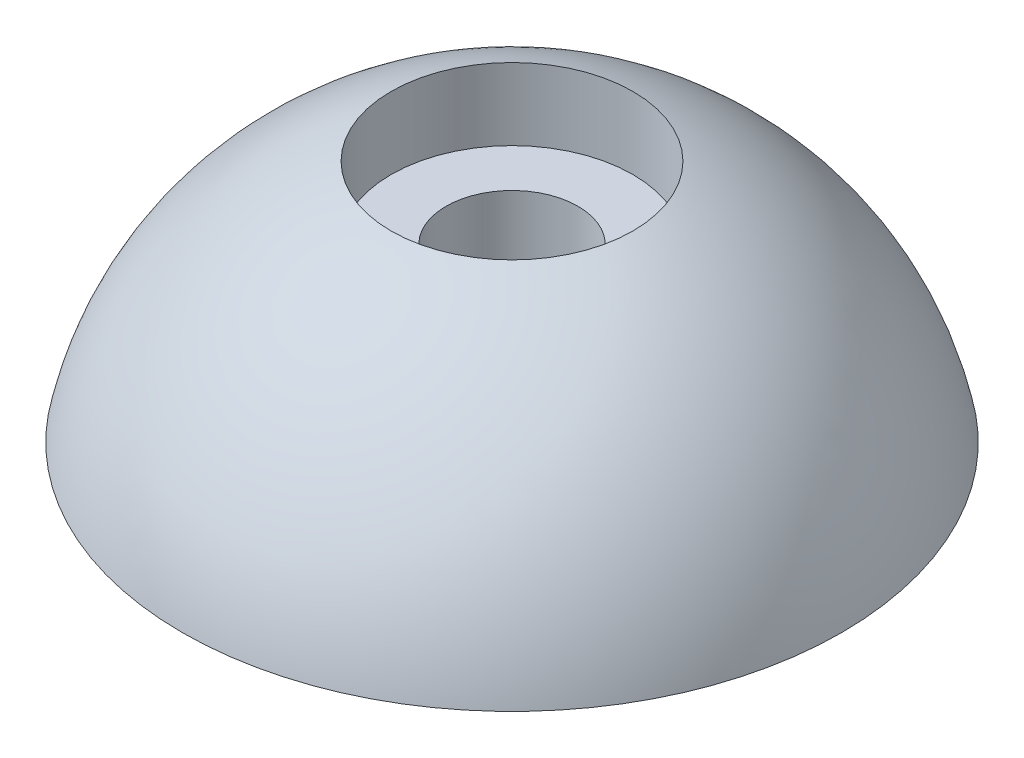
ISO-10303-21;
HEADER;
FILE_DESCRIPTION(('STEP AP214'),'2;1');
FILE_NAME('part.step','',(''),(''),'','','');
FILE_SCHEMA(('AUTOMOTIVE_DESIGN { 1 0 10303 214 1 1 1 1 }'));
ENDSEC;
DATA;
#1=APPLICATION_CONTEXT('core data for automotive mechanical design processes');
#2=APPLICATION_PROTOCOL_DEFINITION('international standard','automotive_design',2000,#1);
#3=PRODUCT_CONTEXT('',#1,'mechanical');
#4=PRODUCT('Part','Part','',(#3));
#5=PRODUCT_RELATED_PRODUCT_CATEGORY('part','',(#4));
#6=PRODUCT_DEFINITION_FORMATION('','',#4);
#7=PRODUCT_DEFINITION_CONTEXT('part definition',#1,'design');
#8=PRODUCT_DEFINITION('design','',#6,#7);
#9=PRODUCT_DEFINITION_SHAPE('','',#8);
#10=(LENGTH_UNIT() NAMED_UNIT(*) SI_UNIT(.MILLI.,.METRE.));
#11=(NAMED_UNIT(*) PLANE_ANGLE_UNIT() SI_UNIT($,.RADIAN.));
#12=(NAMED_UNIT(*) SI_UNIT($,.STERADIAN.) SOLID_ANGLE_UNIT());
#13=UNCERTAINTY_MEASURE_WITH_UNIT(LENGTH_MEASURE(1.E-05),#10,'distance_accuracy_value','');
#14=(GEOMETRIC_REPRESENTATION_CONTEXT(3) GLOBAL_UNCERTAINTY_ASSIGNED_CONTEXT((#13)) GLOBAL_UNIT_ASSIGNED_CONTEXT((#10,
#11,#12)) REPRESENTATION_CONTEXT('',''));
#15=CARTESIAN_POINT('',(0.,0.,0.));
#16=DIRECTION('',(0.,0.,1.));
#17=DIRECTION('',(1.,0.,0.));
#18=AXIS2_PLACEMENT_3D('',#15,#16,#17);
#19=CARTESIAN_POINT('',(0.,-1.49847535147242,0.));
#20=DIRECTION('',(0.,-1.,0.));
#21=DIRECTION('',(0.,0.,-1.));
#22=AXIS2_PLACEMENT_3D('',#19,#20,#21);
#23=DEGENERATE_TOROIDAL_SURFACE('',#22,0.151219718822067,7.5,.T.);
#24=CARTESIAN_POINT('',(0.,0.,0.));
#25=DIRECTION('',(0.,-1.,0.));
#26=DIRECTION('',(0.,0.,-1.));
#27=AXIS2_PLACEMENT_3D('',#24,#25,#26);
#28=CIRCLE('',#27,7.5);
#29=CARTESIAN_POINT('',(0.,0.,-7.5));
#30=VERTEX_POINT('',#29);
#31=EDGE_CURVE('E10',#30,#30,#28,.T.);
#32=ORIENTED_EDGE('',*,*,#31,.F.);
#33=EDGE_LOOP('',(#32));
#34=FACE_BOUND('',#33,.T.);
#35=CARTESIAN_POINT('',(0.,5.53688825321503,0.));
#36=DIRECTION('',(0.,-1.,0.));
#37=DIRECTION('',(0.,0.,-1.));
#38=AXIS2_PLACEMENT_3D('',#35,#36,#37);
#39=CIRCLE('',#38,2.75);
#40=CARTESIAN_POINT('',(0.,5.53688825321503,-2.75));
#41=VERTEX_POINT('',#40);
#42=EDGE_CURVE('E34',#41,#41,#39,.T.);
#43=ORIENTED_EDGE('',*,*,#42,.T.);
#44=EDGE_LOOP('',(#43));
#45=FACE_BOUND('',#44,.T.);
#46=ADVANCED_FACE('F30',(#34,#45),#23,.T.);
#47=CARTESIAN_POINT('',(0.,0.,0.));
#48=DIRECTION('',(0.,-1.,0.));
#49=DIRECTION('',(0.,0.,-1.));
#50=AXIS2_PLACEMENT_3D('',#47,#48,#49);
#51=PLANE('',#50);
#52=CARTESIAN_POINT('',(0.,0.,0.));
#53=DIRECTION('',(0.,-1.,0.));
#54=DIRECTION('',(0.,0.,-1.));
#55=AXIS2_PLACEMENT_3D('',#52,#53,#54);
#56=CIRCLE('',#55,1.5);
#57=CARTESIAN_POINT('',(0.,0.,-1.5));
#58=VERTEX_POINT('',#57);
#59=EDGE_CURVE('E38',#58,#58,#56,.T.);
#60=ORIENTED_EDGE('',*,*,#59,.F.);
#61=EDGE_LOOP('',(#60));
#62=FACE_BOUND('',#61,.T.);
#63=ORIENTED_EDGE('',*,*,#31,.T.);
#64=EDGE_LOOP('',(#63));
#65=FACE_BOUND('',#64,.T.);
#66=ADVANCED_FACE('F32',(#62,#65),#51,.T.);
#67=CARTESIAN_POINT('',(0.,6.00152464852758,0.));
#68=DIRECTION('',(0.,-1.,0.));
#69=DIRECTION('',(0.,0.,-1.));
#70=AXIS2_PLACEMENT_3D('',#67,#68,#69);
#71=CYLINDRICAL_SURFACE('',#70,1.5);
#72=CARTESIAN_POINT('',(0.,3.9,0.));
#73=DIRECTION('',(0.,-1.,0.));
#74=DIRECTION('',(0.,0.,-1.));
#75=AXIS2_PLACEMENT_3D('',#72,#73,#74);
#76=CIRCLE('',#75,1.5);
#77=CARTESIAN_POINT('',(0.,3.9,-1.5));
#78=VERTEX_POINT('',#77);
#79=EDGE_CURVE('E45',#78,#78,#76,.F.);
#80=ORIENTED_EDGE('',*,*,#79,.T.);
#81=EDGE_LOOP('',(#80));
#82=FACE_BOUND('',#81,.T.);
#83=ORIENTED_EDGE('',*,*,#59,.T.);
#84=EDGE_LOOP('',(#83));
#85=FACE_BOUND('',#84,.T.);
#86=ADVANCED_FACE('F59',(#82,#85),#71,.F.);
#87=CARTESIAN_POINT('',(0.,3.9,0.));
#88=DIRECTION('',(0.,-1.,0.));
#89=DIRECTION('',(0.,0.,-1.));
#90=AXIS2_PLACEMENT_3D('',#87,#88,#89);
#91=PLANE('',#90);
#92=CARTESIAN_POINT('',(0.,3.9,0.));
#93=DIRECTION('',(0.,-1.,0.));
#94=DIRECTION('',(0.,0.,-1.));
#95=AXIS2_PLACEMENT_3D('',#92,#93,#94);
#96=CIRCLE('',#95,2.75);
#97=CARTESIAN_POINT('',(0.,3.9,-2.75));
#98=VERTEX_POINT('',#97);
#99=EDGE_CURVE('E47',#98,#98,#96,.T.);
#100=ORIENTED_EDGE('',*,*,#99,.F.);
#101=EDGE_LOOP('',(#100));
#102=FACE_BOUND('',#101,.T.);
#103=ORIENTED_EDGE('',*,*,#79,.F.);
#104=EDGE_LOOP('',(#103));
#105=FACE_BOUND('',#104,.T.);
#106=ADVANCED_FACE('F56',(#102,#105),#91,.F.);
#107=CARTESIAN_POINT('',(0.,3.9,0.));
#108=DIRECTION('',(0.,1.,0.));
#109=DIRECTION('',(0.,0.,1.));
#110=AXIS2_PLACEMENT_3D('',#107,#108,#109);
#111=CYLINDRICAL_SURFACE('',#110,2.75);
#112=ORIENTED_EDGE('',*,*,#42,.F.);
#113=EDGE_LOOP('',(#112));
#114=FACE_BOUND('',#113,.T.);
#115=ORIENTED_EDGE('',*,*,#99,.T.);
#116=EDGE_LOOP('',(#115));
#117=FACE_BOUND('',#116,.T.);
#118=ADVANCED_FACE('F54',(#114,#117),#111,.F.);
#119=CLOSED_SHELL('',(#46,#66,#86,#106,#118));
#120=MANIFOLD_SOLID_BREP('B2',#119);
#121=ADVANCED_BREP_SHAPE_REPRESENTATION('',(#18,#120),#14);
#122=SHAPE_DEFINITION_REPRESENTATION(#9,#121);
ENDSEC;
END-ISO-10303-21;
